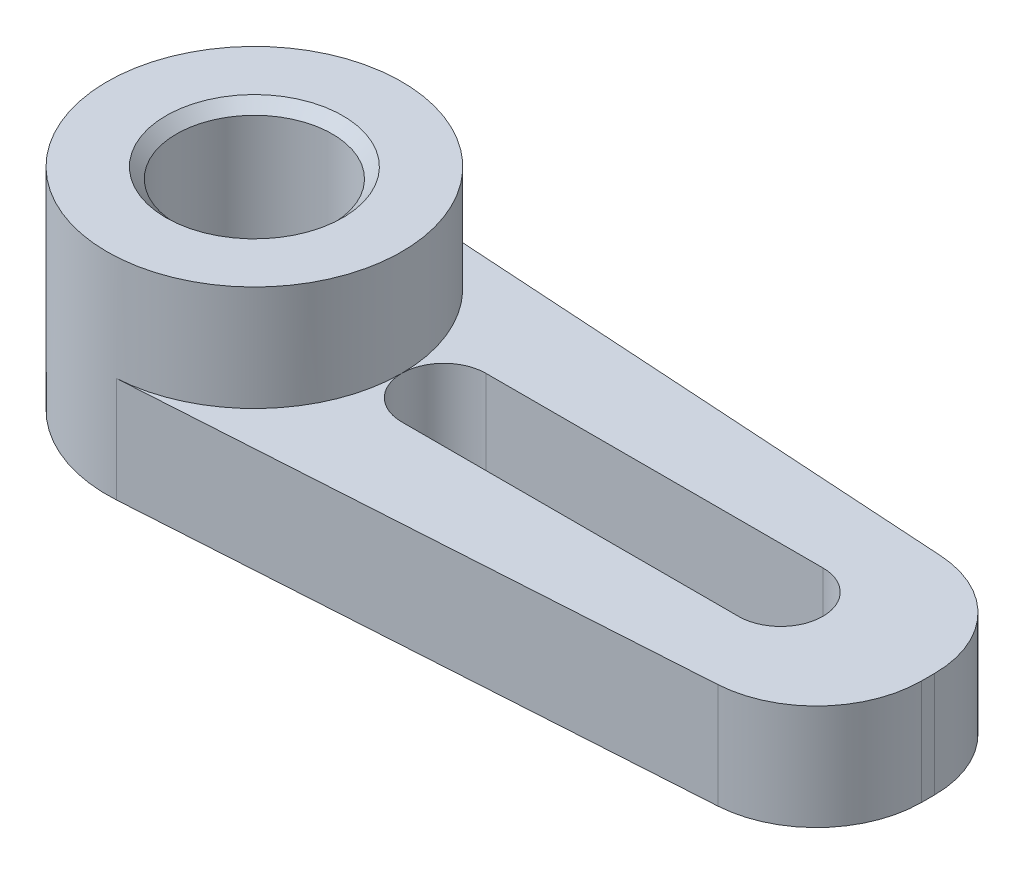
ISO-10303-21;
HEADER;
FILE_DESCRIPTION(('STEP AP214'),'2;1');
FILE_NAME('part.step','',(''),(''),'','','');
FILE_SCHEMA(('AUTOMOTIVE_DESIGN { 1 0 10303 214 1 1 1 1 }'));
ENDSEC;
DATA;
#1=APPLICATION_CONTEXT('core data for automotive mechanical design processes');
#2=APPLICATION_PROTOCOL_DEFINITION('international standard','automotive_design',2000,#1);
#3=PRODUCT_CONTEXT('',#1,'mechanical');
#4=PRODUCT('Part','Part','',(#3));
#5=PRODUCT_RELATED_PRODUCT_CATEGORY('part','',(#4));
#6=PRODUCT_DEFINITION_FORMATION('','',#4);
#7=PRODUCT_DEFINITION_CONTEXT('part definition',#1,'design');
#8=PRODUCT_DEFINITION('design','',#6,#7);
#9=PRODUCT_DEFINITION_SHAPE('','',#8);
#10=(LENGTH_UNIT() NAMED_UNIT(*) SI_UNIT(.MILLI.,.METRE.));
#11=(NAMED_UNIT(*) PLANE_ANGLE_UNIT() SI_UNIT($,.RADIAN.));
#12=(NAMED_UNIT(*) SI_UNIT($,.STERADIAN.) SOLID_ANGLE_UNIT());
#13=UNCERTAINTY_MEASURE_WITH_UNIT(LENGTH_MEASURE(1.E-05),#10,'distance_accuracy_value','');
#14=(GEOMETRIC_REPRESENTATION_CONTEXT(3) GLOBAL_UNCERTAINTY_ASSIGNED_CONTEXT((#13)) GLOBAL_UNIT_ASSIGNED_CONTEXT((#10,
#11,#12)) REPRESENTATION_CONTEXT('',''));
#15=CARTESIAN_POINT('',(0.,0.,0.));
#16=DIRECTION('',(0.,0.,1.));
#17=DIRECTION('',(1.,0.,0.));
#18=AXIS2_PLACEMENT_3D('',#15,#16,#17);
#19=CARTESIAN_POINT('',(0.,2.5,0.));
#20=DIRECTION('',(0.,-1.,0.));
#21=DIRECTION('',(0.,0.,-1.));
#22=AXIS2_PLACEMENT_3D('',#19,#20,#21);
#23=CYLINDRICAL_SURFACE('',#22,1.25);
#24=CARTESIAN_POINT('',(0.,0.,0.));
#25=DIRECTION('',(0.,1.,0.));
#26=DIRECTION('',(0.,0.,1.));
#27=AXIS2_PLACEMENT_3D('',#24,#25,#26);
#28=CIRCLE('',#27,1.25);
#29=CARTESIAN_POINT('',(0.,0.,1.25));
#30=VERTEX_POINT('',#29);
#31=EDGE_CURVE('E171',#30,#30,#28,.T.);
#32=ORIENTED_EDGE('',*,*,#31,.F.);
#33=EDGE_LOOP('',(#32));
#34=FACE_BOUND('',#33,.T.);
#35=CARTESIAN_POINT('',(0.,2.,0.));
#36=DIRECTION('',(0.,1.,0.));
#37=DIRECTION('',(0.,0.,1.));
#38=AXIS2_PLACEMENT_3D('',#35,#36,#37);
#39=CIRCLE('',#38,1.25);
#40=CARTESIAN_POINT('',(0.,2.,1.25));
#41=VERTEX_POINT('',#40);
#42=EDGE_CURVE('E152',#41,#41,#39,.T.);
#43=ORIENTED_EDGE('',*,*,#42,.T.);
#44=EDGE_LOOP('',(#43));
#45=FACE_BOUND('',#44,.T.);
#46=ADVANCED_FACE('F37',(#34,#45),#23,.F.);
#47=CARTESIAN_POINT('',(0.219829751640165,2.5,-3.49308958950294));
#48=DIRECTION('',(0.0628085004686187,0.,-0.99802559700084));
#49=DIRECTION('',(-0.99802559700084,0.,-0.0628085004686187));
#50=AXIS2_PLACEMENT_3D('',#47,#48,#49);
#51=PLANE('',#50);
#52=DIRECTION('',(0.99802559700084,0.,0.0628085004686187));
#53=VECTOR('',#52,1.);
#54=CARTESIAN_POINT('',(0.219829751640165,2.5,-3.49308958950294));
#55=LINE('',#54,#53);
#56=CARTESIAN_POINT('',(0.219829751640166,2.5,-3.49308958950294));
#57=VERTEX_POINT('',#56);
#58=CARTESIAN_POINT('',(13.6570212511716,2.5,-2.64745010777878));
#59=VERTEX_POINT('',#58);
#60=EDGE_CURVE('E168',#57,#59,#55,.T.);
#61=ORIENTED_EDGE('',*,*,#60,.T.);
#62=DIRECTION('',(0.,-1.,0.));
#63=VECTOR('',#62,1.);
#64=CARTESIAN_POINT('',(13.6570212511715,2.5,-2.64745010777878));
#65=LINE('',#64,#63);
#66=CARTESIAN_POINT('',(13.6570212511716,0.,-2.64745010777878));
#67=VERTEX_POINT('',#66);
#68=EDGE_CURVE('E11',#59,#67,#65,.T.);
#69=ORIENTED_EDGE('',*,*,#68,.T.);
#70=DIRECTION('',(0.99802559700084,0.,0.0628085004686187));
#71=VECTOR('',#70,1.);
#72=CARTESIAN_POINT('',(0.219829751640165,0.,-3.49308958950294));
#73=LINE('',#72,#71);
#74=CARTESIAN_POINT('',(0.219829751640166,0.,-3.49308958950294));
#75=VERTEX_POINT('',#74);
#76=EDGE_CURVE('E164',#75,#67,#73,.T.);
#77=ORIENTED_EDGE('',*,*,#76,.F.);
#78=DIRECTION('',(0.,-1.,0.));
#79=VECTOR('',#78,1.);
#80=CARTESIAN_POINT('',(0.219829751640166,2.5,-3.49308958950294));
#81=LINE('',#80,#79);
#82=EDGE_CURVE('E190',#57,#75,#81,.T.);
#83=ORIENTED_EDGE('',*,*,#82,.F.);
#84=EDGE_LOOP('',(#61,#69,#77,#83));
#85=FACE_BOUND('',#84,.T.);
#86=ADVANCED_FACE('F242',(#85),#51,.T.);
#87=CARTESIAN_POINT('',(0.,2.5,0.));
#88=DIRECTION('',(0.,-1.,0.));
#89=DIRECTION('',(0.,0.,-1.));
#90=AXIS2_PLACEMENT_3D('',#87,#88,#89);
#91=CYLINDRICAL_SURFACE('',#90,3.5);
#92=CARTESIAN_POINT('',(0.,0.,0.));
#93=DIRECTION('',(0.,1.,0.));
#94=DIRECTION('',(0.,0.,1.));
#95=AXIS2_PLACEMENT_3D('',#92,#93,#94);
#96=CIRCLE('',#95,3.5);
#97=CARTESIAN_POINT('',(0.219829751640166,0.,3.49308958950294));
#98=VERTEX_POINT('',#97);
#99=EDGE_CURVE('E179',#75,#98,#96,.T.);
#100=ORIENTED_EDGE('',*,*,#99,.T.);
#101=DIRECTION('',(0.,-1.,0.));
#102=VECTOR('',#101,1.);
#103=CARTESIAN_POINT('',(0.219829751640166,2.5,3.49308958950294));
#104=LINE('',#103,#102);
#105=CARTESIAN_POINT('',(0.219829751640166,2.5,3.49308958950294));
#106=VERTEX_POINT('',#105);
#107=EDGE_CURVE('E176',#106,#98,#104,.T.);
#108=ORIENTED_EDGE('',*,*,#107,.F.);
#109=CARTESIAN_POINT('',(0.,2.5,0.));
#110=DIRECTION('',(0.,1.,0.));
#111=DIRECTION('',(0.,0.,1.));
#112=AXIS2_PLACEMENT_3D('',#109,#110,#111);
#113=CIRCLE('',#112,3.5);
#114=CARTESIAN_POINT('',(3.5,2.5,0.));
#115=VERTEX_POINT('',#114);
#116=EDGE_CURVE('E165',#106,#115,#113,.T.);
#117=ORIENTED_EDGE('',*,*,#116,.T.);
#118=EDGE_CURVE('E160',#115,#57,#113,.T.);
#119=ORIENTED_EDGE('',*,*,#118,.T.);
#120=ORIENTED_EDGE('',*,*,#82,.T.);
#121=EDGE_LOOP('',(#100,#108,#117,#119,#120));
#122=FACE_BOUND('',#121,.T.);
#123=CARTESIAN_POINT('',(0.,5.,0.));
#124=DIRECTION('',(0.,1.,0.));
#125=DIRECTION('',(0.,0.,1.));
#126=AXIS2_PLACEMENT_3D('',#123,#124,#125);
#127=CIRCLE('',#126,3.5);
#128=CARTESIAN_POINT('',(0.,5.,3.5));
#129=VERTEX_POINT('',#128);
#130=EDGE_CURVE('E161',#129,#129,#127,.T.);
#131=ORIENTED_EDGE('',*,*,#130,.F.);
#132=EDGE_LOOP('',(#131));
#133=FACE_BOUND('',#132,.T.);
#134=ADVANCED_FACE('F234',(#122,#133),#91,.T.);
#135=CARTESIAN_POINT('',(0.219829751640165,2.5,3.49308958950294));
#136=DIRECTION('',(-0.0628085004686187,0.,-0.99802559700084));
#137=DIRECTION('',(-0.99802559700084,0.,0.0628085004686187));
#138=AXIS2_PLACEMENT_3D('',#135,#136,#137);
#139=PLANE('',#138);
#140=DIRECTION('',(0.99802559700084,0.,-0.0628085004686187));
#141=VECTOR('',#140,1.);
#142=CARTESIAN_POINT('',(0.219829751640165,0.,3.49308958950294));
#143=LINE('',#142,#141);
#144=CARTESIAN_POINT('',(13.6570212511716,0.,2.64745010777878));
#145=VERTEX_POINT('',#144);
#146=EDGE_CURVE('E181',#98,#145,#143,.T.);
#147=ORIENTED_EDGE('',*,*,#146,.T.);
#148=DIRECTION('',(0.,-1.,0.));
#149=VECTOR('',#148,1.);
#150=CARTESIAN_POINT('',(13.6570212511715,2.5,2.64745010777878));
#151=LINE('',#150,#149);
#152=CARTESIAN_POINT('',(13.6570212511716,2.5,2.64745010777878));
#153=VERTEX_POINT('',#152);
#154=EDGE_CURVE('E60',#145,#153,#151,.F.);
#155=ORIENTED_EDGE('',*,*,#154,.T.);
#156=DIRECTION('',(0.99802559700084,0.,-0.0628085004686187));
#157=VECTOR('',#156,1.);
#158=CARTESIAN_POINT('',(0.219829751640165,2.5,3.49308958950294));
#159=LINE('',#158,#157);
#160=EDGE_CURVE('E170',#106,#153,#159,.T.);
#161=ORIENTED_EDGE('',*,*,#160,.F.);
#162=ORIENTED_EDGE('',*,*,#107,.T.);
#163=EDGE_LOOP('',(#147,#155,#161,#162));
#164=FACE_BOUND('',#163,.T.);
#165=ADVANCED_FACE('F231',(#164),#139,.F.);
#166=CARTESIAN_POINT('',(16.,2.5,0.));
#167=DIRECTION('',(1.,0.,0.));
#168=DIRECTION('',(0.,0.,-1.));
#169=AXIS2_PLACEMENT_3D('',#166,#167,#168);
#170=PLANE('',#169);
#171=DIRECTION('',(0.,0.,1.));
#172=VECTOR('',#171,1.);
#173=CARTESIAN_POINT('',(16.,2.5,0.));
#174=LINE('',#173,#172);
#175=CARTESIAN_POINT('',(16.,2.5,-0.15238611527668));
#176=VERTEX_POINT('',#175);
#177=CARTESIAN_POINT('',(16.,2.5,0.15238611527668));
#178=VERTEX_POINT('',#177);
#179=EDGE_CURVE('E173',#176,#178,#174,.T.);
#180=ORIENTED_EDGE('',*,*,#179,.T.);
#181=DIRECTION('',(0.,-1.,0.));
#182=VECTOR('',#181,1.);
#183=CARTESIAN_POINT('',(16.,0.,0.15238611527668));
#184=LINE('',#183,#182);
#185=CARTESIAN_POINT('',(16.,0.,0.15238611527668));
#186=VERTEX_POINT('',#185);
#187=EDGE_CURVE('E209',#178,#186,#184,.T.);
#188=ORIENTED_EDGE('',*,*,#187,.T.);
#189=DIRECTION('',(0.,0.,1.));
#190=VECTOR('',#189,1.);
#191=CARTESIAN_POINT('',(16.,0.,0.));
#192=LINE('',#191,#190);
#193=CARTESIAN_POINT('',(16.,0.,-0.15238611527668));
#194=VERTEX_POINT('',#193);
#195=EDGE_CURVE('E183',#194,#186,#192,.T.);
#196=ORIENTED_EDGE('',*,*,#195,.F.);
#197=DIRECTION('',(0.,-1.,0.));
#198=VECTOR('',#197,1.);
#199=CARTESIAN_POINT('',(16.,2.5,-0.15238611527668));
#200=LINE('',#199,#198);
#201=EDGE_CURVE('E207',#194,#176,#200,.F.);
#202=ORIENTED_EDGE('',*,*,#201,.T.);
#203=EDGE_LOOP('',(#180,#188,#196,#202));
#204=FACE_BOUND('',#203,.T.);
#205=ADVANCED_FACE('F222',(#204),#170,.T.);
#206=CARTESIAN_POINT('',(0.,2.5,0.));
#207=DIRECTION('',(0.,1.,0.));
#208=DIRECTION('',(0.,0.,1.));
#209=AXIS2_PLACEMENT_3D('',#206,#207,#208);
#210=PLANE('',#209);
#211=ORIENTED_EDGE('',*,*,#160,.T.);
#212=CARTESIAN_POINT('',(13.5,2.5,0.15238611527668));
#213=DIRECTION('',(0.,1.,0.));
#214=DIRECTION('',(0.,0.,1.));
#215=AXIS2_PLACEMENT_3D('',#212,#213,#214);
#216=CIRCLE('',#215,2.5);
#217=EDGE_CURVE('E45',#153,#178,#216,.T.);
#218=ORIENTED_EDGE('',*,*,#217,.T.);
#219=ORIENTED_EDGE('',*,*,#179,.F.);
#220=CARTESIAN_POINT('',(13.5,2.5,-0.15238611527668));
#221=DIRECTION('',(0.,1.,0.));
#222=DIRECTION('',(0.,0.,1.));
#223=AXIS2_PLACEMENT_3D('',#220,#221,#222);
#224=CIRCLE('',#223,2.5);
#225=EDGE_CURVE('E52',#176,#59,#224,.T.);
#226=ORIENTED_EDGE('',*,*,#225,.T.);
#227=ORIENTED_EDGE('',*,*,#60,.F.);
#228=ORIENTED_EDGE('',*,*,#118,.F.);
#229=CARTESIAN_POINT('',(4.5,2.5,0.));
#230=DIRECTION('',(0.,1.,0.));
#231=DIRECTION('',(0.,0.,1.));
#232=AXIS2_PLACEMENT_3D('',#229,#230,#231);
#233=CIRCLE('',#232,1.);
#234=CARTESIAN_POINT('',(4.5,2.5,-1.));
#235=VERTEX_POINT('',#234);
#236=EDGE_CURVE('E140',#235,#115,#233,.T.);
#237=ORIENTED_EDGE('',*,*,#236,.F.);
#238=DIRECTION('',(-1.,0.,0.));
#239=VECTOR('',#238,1.);
#240=CARTESIAN_POINT('',(4.5,2.5,-1.));
#241=LINE('',#240,#239);
#242=CARTESIAN_POINT('',(12.5,2.5,-1.));
#243=VERTEX_POINT('',#242);
#244=EDGE_CURVE('E145',#243,#235,#241,.T.);
#245=ORIENTED_EDGE('',*,*,#244,.F.);
#246=CARTESIAN_POINT('',(12.5,2.5,0.));
#247=DIRECTION('',(0.,1.,0.));
#248=DIRECTION('',(0.,0.,1.));
#249=AXIS2_PLACEMENT_3D('',#246,#247,#248);
#250=CIRCLE('',#249,1.);
#251=CARTESIAN_POINT('',(12.5,2.5,0.999999999999999));
#252=VERTEX_POINT('',#251);
#253=EDGE_CURVE('E125',#252,#243,#250,.T.);
#254=ORIENTED_EDGE('',*,*,#253,.F.);
#255=DIRECTION('',(1.,0.,0.));
#256=VECTOR('',#255,1.);
#257=CARTESIAN_POINT('',(4.5,2.5,1.));
#258=LINE('',#257,#256);
#259=CARTESIAN_POINT('',(4.5,2.5,1.));
#260=VERTEX_POINT('',#259);
#261=EDGE_CURVE('E135',#260,#252,#258,.T.);
#262=ORIENTED_EDGE('',*,*,#261,.F.);
#263=EDGE_CURVE('E236',#115,#260,#233,.T.);
#264=ORIENTED_EDGE('',*,*,#263,.F.);
#265=ORIENTED_EDGE('',*,*,#116,.F.);
#266=EDGE_LOOP('',(#211,#218,#219,#226,#227,#228,#237,#245,#254,#262,#264,#265));
#267=FACE_BOUND('',#266,.T.);
#268=ADVANCED_FACE('F142',(#267),#210,.T.);
#269=CARTESIAN_POINT('',(0.,0.,0.));
#270=DIRECTION('',(0.,1.,0.));
#271=DIRECTION('',(0.,0.,1.));
#272=AXIS2_PLACEMENT_3D('',#269,#270,#271);
#273=PLANE('',#272);
#274=DIRECTION('',(-1.,0.,0.));
#275=VECTOR('',#274,1.);
#276=CARTESIAN_POINT('',(0.,0.,-0.999999999999999));
#277=LINE('',#276,#275);
#278=CARTESIAN_POINT('',(12.5,0.,-1.));
#279=VERTEX_POINT('',#278);
#280=CARTESIAN_POINT('',(4.5,0.,-1.));
#281=VERTEX_POINT('',#280);
#282=EDGE_CURVE('E201',#279,#281,#277,.T.);
#283=ORIENTED_EDGE('',*,*,#282,.T.);
#284=CARTESIAN_POINT('',(4.5,0.,0.));
#285=DIRECTION('',(0.,1.,0.));
#286=DIRECTION('',(0.,0.,1.));
#287=AXIS2_PLACEMENT_3D('',#284,#285,#286);
#288=CIRCLE('',#287,1.);
#289=CARTESIAN_POINT('',(4.5,0.,1.));
#290=VERTEX_POINT('',#289);
#291=EDGE_CURVE('E204',#281,#290,#288,.T.);
#292=ORIENTED_EDGE('',*,*,#291,.T.);
#293=DIRECTION('',(1.,0.,0.));
#294=VECTOR('',#293,1.);
#295=CARTESIAN_POINT('',(0.,0.,1.));
#296=LINE('',#295,#294);
#297=CARTESIAN_POINT('',(12.5,0.,0.999999999999999));
#298=VERTEX_POINT('',#297);
#299=EDGE_CURVE('E198',#290,#298,#296,.T.);
#300=ORIENTED_EDGE('',*,*,#299,.T.);
#301=CARTESIAN_POINT('',(12.5,0.,0.));
#302=DIRECTION('',(0.,1.,0.));
#303=DIRECTION('',(0.,0.,1.));
#304=AXIS2_PLACEMENT_3D('',#301,#302,#303);
#305=CIRCLE('',#304,1.);
#306=EDGE_CURVE('E128',#298,#279,#305,.T.);
#307=ORIENTED_EDGE('',*,*,#306,.T.);
#308=EDGE_LOOP('',(#283,#292,#300,#307));
#309=FACE_BOUND('',#308,.T.);
#310=ORIENTED_EDGE('',*,*,#195,.T.);
#311=CARTESIAN_POINT('',(13.5,0.,0.15238611527668));
#312=DIRECTION('',(0.,1.,0.));
#313=DIRECTION('',(0.,0.,1.));
#314=AXIS2_PLACEMENT_3D('',#311,#312,#313);
#315=CIRCLE('',#314,2.5);
#316=EDGE_CURVE('E214',#186,#145,#315,.F.);
#317=ORIENTED_EDGE('',*,*,#316,.T.);
#318=ORIENTED_EDGE('',*,*,#146,.F.);
#319=ORIENTED_EDGE('',*,*,#99,.F.);
#320=ORIENTED_EDGE('',*,*,#76,.T.);
#321=CARTESIAN_POINT('',(13.5,0.,-0.15238611527668));
#322=DIRECTION('',(0.,1.,0.));
#323=DIRECTION('',(0.,0.,1.));
#324=AXIS2_PLACEMENT_3D('',#321,#322,#323);
#325=CIRCLE('',#324,2.5);
#326=EDGE_CURVE('E212',#67,#194,#325,.F.);
#327=ORIENTED_EDGE('',*,*,#326,.T.);
#328=EDGE_LOOP('',(#310,#317,#318,#319,#320,#327));
#329=FACE_BOUND('',#328,.T.);
#330=ORIENTED_EDGE('',*,*,#31,.T.);
#331=EDGE_LOOP('',(#330));
#332=FACE_BOUND('',#331,.T.);
#333=ADVANCED_FACE('F228',(#309,#329,#332),#273,.F.);
#334=CARTESIAN_POINT('',(0.,5.,0.));
#335=DIRECTION('',(0.,1.,0.));
#336=DIRECTION('',(0.,0.,1.));
#337=AXIS2_PLACEMENT_3D('',#334,#335,#336);
#338=PLANE('',#337);
#339=CARTESIAN_POINT('',(0.,5.,0.));
#340=DIRECTION('',(0.,1.,0.));
#341=DIRECTION('',(0.,0.,1.));
#342=AXIS2_PLACEMENT_3D('',#339,#340,#341);
#343=CIRCLE('',#342,2.1);
#344=CARTESIAN_POINT('',(0.,5.,2.1));
#345=VERTEX_POINT('',#344);
#346=EDGE_CURVE('E195',#345,#345,#343,.F.);
#347=ORIENTED_EDGE('',*,*,#346,.T.);
#348=EDGE_LOOP('',(#347));
#349=FACE_BOUND('',#348,.T.);
#350=ORIENTED_EDGE('',*,*,#130,.T.);
#351=EDGE_LOOP('',(#350));
#352=FACE_BOUND('',#351,.T.);
#353=ADVANCED_FACE('F290',(#349,#352),#338,.T.);
#354=CARTESIAN_POINT('',(0.,2.,0.));
#355=DIRECTION('',(0.,1.,0.));
#356=DIRECTION('',(0.,0.,1.));
#357=AXIS2_PLACEMENT_3D('',#354,#355,#356);
#358=CYLINDRICAL_SURFACE('',#357,1.85);
#359=CARTESIAN_POINT('',(0.,4.75,0.));
#360=DIRECTION('',(0.,1.,0.));
#361=DIRECTION('',(0.,0.,1.));
#362=AXIS2_PLACEMENT_3D('',#359,#360,#361);
#363=CIRCLE('',#362,1.85);
#364=CARTESIAN_POINT('',(0.,4.75,1.85));
#365=VERTEX_POINT('',#364);
#366=EDGE_CURVE('E192',#365,#365,#363,.T.);
#367=ORIENTED_EDGE('',*,*,#366,.T.);
#368=EDGE_LOOP('',(#367));
#369=FACE_BOUND('',#368,.T.);
#370=CARTESIAN_POINT('',(0.,2.,0.));
#371=DIRECTION('',(0.,1.,0.));
#372=DIRECTION('',(0.,0.,1.));
#373=AXIS2_PLACEMENT_3D('',#370,#371,#372);
#374=CIRCLE('',#373,1.85);
#375=CARTESIAN_POINT('',(0.,2.,1.85));
#376=VERTEX_POINT('',#375);
#377=EDGE_CURVE('E157',#376,#376,#374,.T.);
#378=ORIENTED_EDGE('',*,*,#377,.F.);
#379=EDGE_LOOP('',(#378));
#380=FACE_BOUND('',#379,.T.);
#381=ADVANCED_FACE('F281',(#369,#380),#358,.F.);
#382=CARTESIAN_POINT('',(0.,2.,0.));
#383=DIRECTION('',(0.,1.,0.));
#384=DIRECTION('',(0.,0.,1.));
#385=AXIS2_PLACEMENT_3D('',#382,#383,#384);
#386=PLANE('',#385);
#387=ORIENTED_EDGE('',*,*,#42,.F.);
#388=EDGE_LOOP('',(#387));
#389=FACE_BOUND('',#388,.T.);
#390=ORIENTED_EDGE('',*,*,#377,.T.);
#391=EDGE_LOOP('',(#390));
#392=FACE_BOUND('',#391,.T.);
#393=ADVANCED_FACE('F273',(#389,#392),#386,.T.);
#394=CARTESIAN_POINT('',(0.,4.75,0.));
#395=DIRECTION('',(0.,1.,0.));
#396=DIRECTION('',(0.,0.,1.));
#397=AXIS2_PLACEMENT_3D('',#394,#395,#396);
#398=CONICAL_SURFACE('',#397,1.85,0.78539816339745);
#399=ORIENTED_EDGE('',*,*,#346,.F.);
#400=EDGE_LOOP('',(#399));
#401=FACE_BOUND('',#400,.T.);
#402=ORIENTED_EDGE('',*,*,#366,.F.);
#403=EDGE_LOOP('',(#402));
#404=FACE_BOUND('',#403,.T.);
#405=ADVANCED_FACE('F268',(#401,#404),#398,.F.);
#406=CARTESIAN_POINT('',(4.5,-0.5,0.));
#407=DIRECTION('',(0.,1.,0.));
#408=DIRECTION('',(0.,0.,1.));
#409=AXIS2_PLACEMENT_3D('',#406,#407,#408);
#410=CYLINDRICAL_SURFACE('',#409,1.);
#411=DIRECTION('',(0.,1.,0.));
#412=VECTOR('',#411,1.);
#413=CARTESIAN_POINT('',(4.5,-0.5,-1.));
#414=LINE('',#413,#412);
#415=EDGE_CURVE('E150',#281,#235,#414,.T.);
#416=ORIENTED_EDGE('',*,*,#415,.T.);
#417=ORIENTED_EDGE('',*,*,#236,.T.);
#418=ORIENTED_EDGE('',*,*,#263,.T.);
#419=DIRECTION('',(0.,1.,0.));
#420=VECTOR('',#419,1.);
#421=CARTESIAN_POINT('',(4.5,-0.5,1.));
#422=LINE('',#421,#420);
#423=EDGE_CURVE('E132',#290,#260,#422,.T.);
#424=ORIENTED_EDGE('',*,*,#423,.F.);
#425=ORIENTED_EDGE('',*,*,#291,.F.);
#426=EDGE_LOOP('',(#416,#417,#418,#424,#425));
#427=FACE_BOUND('',#426,.T.);
#428=ADVANCED_FACE('F272',(#427),#410,.F.);
#429=CARTESIAN_POINT('',(4.5,-0.5,-1.));
#430=DIRECTION('',(0.,0.,-1.));
#431=DIRECTION('',(-1.,0.,0.));
#432=AXIS2_PLACEMENT_3D('',#429,#430,#431);
#433=PLANE('',#432);
#434=DIRECTION('',(0.,1.,0.));
#435=VECTOR('',#434,1.);
#436=CARTESIAN_POINT('',(12.5,-0.5,-1.));
#437=LINE('',#436,#435);
#438=EDGE_CURVE('E131',#279,#243,#437,.T.);
#439=ORIENTED_EDGE('',*,*,#438,.T.);
#440=ORIENTED_EDGE('',*,*,#244,.T.);
#441=ORIENTED_EDGE('',*,*,#415,.F.);
#442=ORIENTED_EDGE('',*,*,#282,.F.);
#443=EDGE_LOOP('',(#439,#440,#441,#442));
#444=FACE_BOUND('',#443,.T.);
#445=ADVANCED_FACE('F279',(#444),#433,.F.);
#446=CARTESIAN_POINT('',(12.5,-0.5,0.));
#447=DIRECTION('',(0.,1.,0.));
#448=DIRECTION('',(0.,0.,1.));
#449=AXIS2_PLACEMENT_3D('',#446,#447,#448);
#450=CYLINDRICAL_SURFACE('',#449,1.);
#451=DIRECTION('',(0.,1.,0.));
#452=VECTOR('',#451,1.);
#453=CARTESIAN_POINT('',(12.5,-0.5,0.999999999999999));
#454=LINE('',#453,#452);
#455=EDGE_CURVE('E120',#298,#252,#454,.T.);
#456=ORIENTED_EDGE('',*,*,#455,.T.);
#457=ORIENTED_EDGE('',*,*,#253,.T.);
#458=ORIENTED_EDGE('',*,*,#438,.F.);
#459=ORIENTED_EDGE('',*,*,#306,.F.);
#460=EDGE_LOOP('',(#456,#457,#458,#459));
#461=FACE_BOUND('',#460,.T.);
#462=ADVANCED_FACE('F122',(#461),#450,.F.);
#463=CARTESIAN_POINT('',(4.5,-0.5,1.));
#464=DIRECTION('',(0.,0.,1.));
#465=DIRECTION('',(1.,0.,0.));
#466=AXIS2_PLACEMENT_3D('',#463,#464,#465);
#467=PLANE('',#466);
#468=ORIENTED_EDGE('',*,*,#423,.T.);
#469=ORIENTED_EDGE('',*,*,#261,.T.);
#470=ORIENTED_EDGE('',*,*,#455,.F.);
#471=ORIENTED_EDGE('',*,*,#299,.F.);
#472=EDGE_LOOP('',(#468,#469,#470,#471));
#473=FACE_BOUND('',#472,.T.);
#474=ADVANCED_FACE('F136',(#473),#467,.F.);
#475=CARTESIAN_POINT('',(13.5,2.5,0.15238611527668));
#476=DIRECTION('',(0.,1.,0.));
#477=DIRECTION('',(0.,0.,1.));
#478=AXIS2_PLACEMENT_3D('',#475,#476,#477);
#479=CYLINDRICAL_SURFACE('',#478,2.5);
#480=ORIENTED_EDGE('',*,*,#217,.F.);
#481=ORIENTED_EDGE('',*,*,#154,.F.);
#482=ORIENTED_EDGE('',*,*,#316,.F.);
#483=ORIENTED_EDGE('',*,*,#187,.F.);
#484=EDGE_LOOP('',(#480,#481,#482,#483));
#485=FACE_BOUND('',#484,.T.);
#486=ADVANCED_FACE('F225',(#485),#479,.T.);
#487=CARTESIAN_POINT('',(13.5,2.5,-0.15238611527668));
#488=DIRECTION('',(0.,-1.,0.));
#489=DIRECTION('',(0.,0.,-1.));
#490=AXIS2_PLACEMENT_3D('',#487,#488,#489);
#491=CYLINDRICAL_SURFACE('',#490,2.5);
#492=ORIENTED_EDGE('',*,*,#225,.F.);
#493=ORIENTED_EDGE('',*,*,#201,.F.);
#494=ORIENTED_EDGE('',*,*,#326,.F.);
#495=ORIENTED_EDGE('',*,*,#68,.F.);
#496=EDGE_LOOP('',(#492,#493,#494,#495));
#497=FACE_BOUND('',#496,.T.);
#498=ADVANCED_FACE('F39',(#497),#491,.T.);
#499=CLOSED_SHELL('',(#46,#86,#134,#165,#205,#268,#333,#353,#381,#393,#405,#428,#445,#462,#474,
#486,#498));
#500=MANIFOLD_SOLID_BREP('B2',#499);
#501=ADVANCED_BREP_SHAPE_REPRESENTATION('',(#18,#500),#14);
#502=SHAPE_DEFINITION_REPRESENTATION(#9,#501);
ENDSEC;
END-ISO-10303-21;
